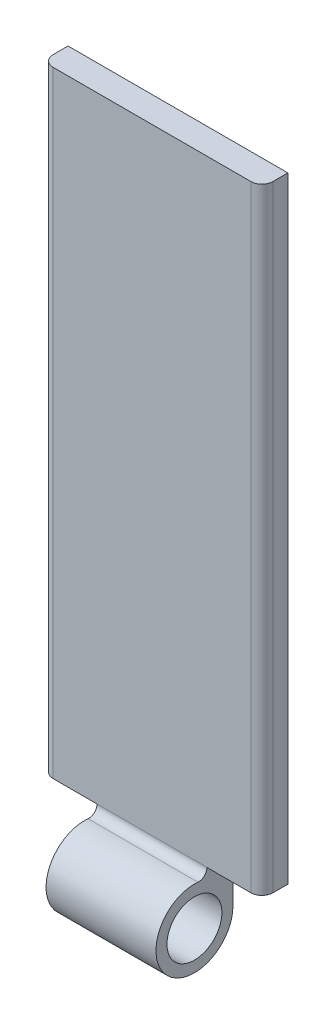
ISO-10303-21;
HEADER;
FILE_DESCRIPTION(('STEP AP214'),'2;1');
FILE_NAME('part.step','',(''),(''),'','','');
FILE_SCHEMA(('AUTOMOTIVE_DESIGN { 1 0 10303 214 1 1 1 1 }'));
ENDSEC;
DATA;
#1=APPLICATION_CONTEXT('core data for automotive mechanical design processes');
#2=APPLICATION_PROTOCOL_DEFINITION('international standard','automotive_design',2000,#1);
#3=PRODUCT_CONTEXT('',#1,'mechanical');
#4=PRODUCT('Part','Part','',(#3));
#5=PRODUCT_RELATED_PRODUCT_CATEGORY('part','',(#4));
#6=PRODUCT_DEFINITION_FORMATION('','',#4);
#7=PRODUCT_DEFINITION_CONTEXT('part definition',#1,'design');
#8=PRODUCT_DEFINITION('design','',#6,#7);
#9=PRODUCT_DEFINITION_SHAPE('','',#8);
#10=(LENGTH_UNIT() NAMED_UNIT(*) SI_UNIT(.MILLI.,.METRE.));
#11=(NAMED_UNIT(*) PLANE_ANGLE_UNIT() SI_UNIT($,.RADIAN.));
#12=(NAMED_UNIT(*) SI_UNIT($,.STERADIAN.) SOLID_ANGLE_UNIT());
#13=UNCERTAINTY_MEASURE_WITH_UNIT(LENGTH_MEASURE(1.E-05),#10,'distance_accuracy_value','');
#14=(GEOMETRIC_REPRESENTATION_CONTEXT(3) GLOBAL_UNCERTAINTY_ASSIGNED_CONTEXT((#13)) GLOBAL_UNIT_ASSIGNED_CONTEXT((#10,
#11,#12)) REPRESENTATION_CONTEXT('',''));
#15=CARTESIAN_POINT('',(0.,0.,0.));
#16=DIRECTION('',(0.,0.,1.));
#17=DIRECTION('',(1.,0.,0.));
#18=AXIS2_PLACEMENT_3D('',#15,#16,#17);
#19=CARTESIAN_POINT('',(25.4,-29.6203427117748,2.02927864234114));
#20=DIRECTION('',(-1.,0.,0.));
#21=DIRECTION('',(0.,0.,1.));
#22=AXIS2_PLACEMENT_3D('',#19,#20,#21);
#23=CYLINDRICAL_SURFACE('',#22,1.43383967509494);
#24=DIRECTION('',(-1.,0.,0.));
#25=VECTOR('',#24,1.);
#26=CARTESIAN_POINT('',(25.4,-29.6203427117748,0.595438967246198));
#27=LINE('',#26,#25);
#28=CARTESIAN_POINT('',(15.875,-29.6203427117748,0.595438967246198));
#29=VERTEX_POINT('',#28);
#30=CARTESIAN_POINT('',(-3.175,-29.6203427117748,0.595438967246198));
#31=VERTEX_POINT('',#30);
#32=EDGE_CURVE('E129',#29,#31,#27,.T.);
#33=ORIENTED_EDGE('',*,*,#32,.T.);
#34=CARTESIAN_POINT('',(-3.175,-29.6203427117748,2.02927864234114));
#35=DIRECTION('',(1.,0.,0.));
#36=DIRECTION('',(0.,0.,-1.));
#37=AXIS2_PLACEMENT_3D('',#34,#35,#36);
#38=CIRCLE('',#37,1.43383967509494);
#39=CARTESIAN_POINT('',(-3.175,-31.0482451370392,2.15962770371341));
#40=VERTEX_POINT('',#39);
#41=EDGE_CURVE('E208',#31,#40,#38,.F.);
#42=ORIENTED_EDGE('',*,*,#41,.T.);
#43=DIRECTION('',(-1.,0.,0.));
#44=VECTOR('',#43,1.);
#45=CARTESIAN_POINT('',(25.4,-31.0482451370391,2.15962770371341));
#46=LINE('',#45,#44);
#47=CARTESIAN_POINT('',(15.875,-31.0482451370392,2.15962770371341));
#48=VERTEX_POINT('',#47);
#49=EDGE_CURVE('E147',#48,#40,#46,.T.);
#50=ORIENTED_EDGE('',*,*,#49,.F.);
#51=CARTESIAN_POINT('',(15.875,-29.6203427117748,2.02927864234114));
#52=DIRECTION('',(1.,0.,0.));
#53=DIRECTION('',(0.,0.,-1.));
#54=AXIS2_PLACEMENT_3D('',#51,#52,#53);
#55=CIRCLE('',#54,1.43383967509494);
#56=EDGE_CURVE('E135',#29,#48,#55,.F.);
#57=ORIENTED_EDGE('',*,*,#56,.F.);
#58=EDGE_LOOP('',(#33,#42,#50,#57));
#59=FACE_BOUND('',#58,.T.);
#60=ADVANCED_FACE('F39',(#59),#23,.F.);
#61=CARTESIAN_POINT('',(25.4,-37.688136322795,2.76576406734977));
#62=DIRECTION('',(-1.,0.,0.));
#63=DIRECTION('',(0.,0.,1.));
#64=AXIS2_PLACEMENT_3D('',#61,#62,#63);
#65=CYLINDRICAL_SURFACE('',#64,6.6675);
#66=ORIENTED_EDGE('',*,*,#49,.T.);
#67=CARTESIAN_POINT('',(-3.175,-37.688136322795,2.76576406734977));
#68=DIRECTION('',(1.,0.,0.));
#69=DIRECTION('',(0.,0.,-1.));
#70=AXIS2_PLACEMENT_3D('',#67,#68,#69);
#71=CIRCLE('',#70,6.6675);
#72=CARTESIAN_POINT('',(-3.175,-37.688136322795,-3.90173593265023));
#73=VERTEX_POINT('',#72);
#74=EDGE_CURVE('E214',#40,#73,#71,.T.);
#75=ORIENTED_EDGE('',*,*,#74,.T.);
#76=DIRECTION('',(-1.,0.,0.));
#77=VECTOR('',#76,1.);
#78=CARTESIAN_POINT('',(25.4,-37.688136322795,-3.90173593265023));
#79=LINE('',#78,#77);
#80=CARTESIAN_POINT('',(15.875,-37.688136322795,-3.90173593265023));
#81=VERTEX_POINT('',#80);
#82=EDGE_CURVE('E170',#81,#73,#79,.T.);
#83=ORIENTED_EDGE('',*,*,#82,.F.);
#84=CARTESIAN_POINT('',(15.875,-37.688136322795,2.76576406734977));
#85=DIRECTION('',(1.,0.,0.));
#86=DIRECTION('',(0.,0.,-1.));
#87=AXIS2_PLACEMENT_3D('',#84,#85,#86);
#88=CIRCLE('',#87,6.6675);
#89=EDGE_CURVE('E150',#48,#81,#88,.T.);
#90=ORIENTED_EDGE('',*,*,#89,.F.);
#91=EDGE_LOOP('',(#66,#75,#83,#90));
#92=FACE_BOUND('',#91,.T.);
#93=ADVANCED_FACE('F252',(#92),#65,.T.);
#94=CARTESIAN_POINT('',(25.4,-37.688136322795,-3.90173593265023));
#95=DIRECTION('',(0.,0.,1.));
#96=DIRECTION('',(1.,0.,0.));
#97=AXIS2_PLACEMENT_3D('',#94,#95,#96);
#98=PLANE('',#97);
#99=ORIENTED_EDGE('',*,*,#82,.T.);
#100=DIRECTION('',(0.,1.,0.));
#101=VECTOR('',#100,1.);
#102=CARTESIAN_POINT('',(-3.175,-37.688136322795,-3.90173593265023));
#103=LINE('',#102,#101);
#104=CARTESIAN_POINT('',(-3.175,-29.6203427117748,-3.90173593265022));
#105=VERTEX_POINT('',#104);
#106=EDGE_CURVE('E185',#73,#105,#103,.T.);
#107=ORIENTED_EDGE('',*,*,#106,.T.);
#108=DIRECTION('',(-1.,0.,0.));
#109=VECTOR('',#108,1.);
#110=CARTESIAN_POINT('',(25.4,-29.6203427117748,-3.90173593265023));
#111=LINE('',#110,#109);
#112=CARTESIAN_POINT('',(-12.7,-29.6203427117748,-3.90173593265022));
#113=VERTEX_POINT('',#112);
#114=EDGE_CURVE('E212',#105,#113,#111,.T.);
#115=ORIENTED_EDGE('',*,*,#114,.T.);
#116=DIRECTION('',(0.,1.,0.));
#117=VECTOR('',#116,1.);
#118=CARTESIAN_POINT('',(-12.7,-37.688136322795,-3.90173593265023));
#119=LINE('',#118,#117);
#120=CARTESIAN_POINT('',(-12.7,77.155863613327,-3.90173593265023));
#121=VERTEX_POINT('',#120);
#122=EDGE_CURVE('E221',#113,#121,#119,.T.);
#123=ORIENTED_EDGE('',*,*,#122,.T.);
#124=DIRECTION('',(-1.,0.,0.));
#125=VECTOR('',#124,1.);
#126=CARTESIAN_POINT('',(25.4,77.155863613327,-3.90173593265023));
#127=LINE('',#126,#125);
#128=CARTESIAN_POINT('',(25.4,77.155863613327,-3.90173593265023));
#129=VERTEX_POINT('',#128);
#130=EDGE_CURVE('E166',#129,#121,#127,.T.);
#131=ORIENTED_EDGE('',*,*,#130,.F.);
#132=DIRECTION('',(0.,1.,0.));
#133=VECTOR('',#132,1.);
#134=CARTESIAN_POINT('',(25.4,-37.688136322795,-3.90173593265023));
#135=LINE('',#134,#133);
#136=CARTESIAN_POINT('',(25.4,-29.6203427117748,-3.90173593265023));
#137=VERTEX_POINT('',#136);
#138=EDGE_CURVE('E222',#137,#129,#135,.T.);
#139=ORIENTED_EDGE('',*,*,#138,.F.);
#140=DIRECTION('',(-1.,0.,0.));
#141=VECTOR('',#140,1.);
#142=CARTESIAN_POINT('',(25.4,-29.6203427117748,-3.90173593265023));
#143=LINE('',#142,#141);
#144=CARTESIAN_POINT('',(15.875,-29.6203427117748,-3.90173593265022));
#145=VERTEX_POINT('',#144);
#146=EDGE_CURVE('E205',#137,#145,#143,.T.);
#147=ORIENTED_EDGE('',*,*,#146,.T.);
#148=DIRECTION('',(0.,1.,0.));
#149=VECTOR('',#148,1.);
#150=CARTESIAN_POINT('',(15.875,-37.688136322795,-3.90173593265023));
#151=LINE('',#150,#149);
#152=EDGE_CURVE('E138',#81,#145,#151,.T.);
#153=ORIENTED_EDGE('',*,*,#152,.F.);
#154=EDGE_LOOP('',(#99,#107,#115,#123,#131,#139,#147,#153));
#155=FACE_BOUND('',#154,.T.);
#156=ADVANCED_FACE('F261',(#155),#98,.F.);
#157=CARTESIAN_POINT('',(25.4,-29.6203427117748,2.02927864234114));
#158=DIRECTION('',(-1.,0.,0.));
#159=DIRECTION('',(0.,0.,1.));
#160=AXIS2_PLACEMENT_3D('',#157,#158,#159);
#161=PLANE('',#160);
#162=DIRECTION('',(0.,0.,1.));
#163=VECTOR('',#162,1.);
#164=CARTESIAN_POINT('',(25.4,77.155863613327,-3.90173593265023));
#165=LINE('',#164,#163);
#166=CARTESIAN_POINT('',(25.4,77.155863613327,-1.3095610327538));
#167=VERTEX_POINT('',#166);
#168=EDGE_CURVE('E159',#129,#167,#165,.T.);
#169=ORIENTED_EDGE('',*,*,#168,.T.);
#170=DIRECTION('',(0.,-1.,0.));
#171=VECTOR('',#170,1.);
#172=CARTESIAN_POINT('',(25.4,-29.6203427117748,-1.3095610327538));
#173=LINE('',#172,#171);
#174=CARTESIAN_POINT('',(25.4,-29.6203427117748,-1.3095610327538));
#175=VERTEX_POINT('',#174);
#176=EDGE_CURVE('E48',#167,#175,#173,.T.);
#177=ORIENTED_EDGE('',*,*,#176,.T.);
#178=DIRECTION('',(0.,0.,-1.));
#179=VECTOR('',#178,1.);
#180=CARTESIAN_POINT('',(25.4,-29.6203427117748,2.02927864234114));
#181=LINE('',#180,#179);
#182=EDGE_CURVE('E204',#175,#137,#181,.T.);
#183=ORIENTED_EDGE('',*,*,#182,.T.);
#184=ORIENTED_EDGE('',*,*,#138,.T.);
#185=EDGE_LOOP('',(#169,#177,#183,#184));
#186=FACE_BOUND('',#185,.T.);
#187=ADVANCED_FACE('F203',(#186),#161,.F.);
#188=CARTESIAN_POINT('',(-12.7,-29.6203427117748,2.02927864234114));
#189=DIRECTION('',(-1.,0.,0.));
#190=DIRECTION('',(0.,0.,1.));
#191=AXIS2_PLACEMENT_3D('',#188,#189,#190);
#192=PLANE('',#191);
#193=DIRECTION('',(0.,0.,-1.));
#194=VECTOR('',#193,1.);
#195=CARTESIAN_POINT('',(-12.7,-29.6203427117748,38.6954389672462));
#196=LINE('',#195,#194);
#197=CARTESIAN_POINT('',(-12.7,-29.6203427117748,-1.3095610327538));
#198=VERTEX_POINT('',#197);
#199=EDGE_CURVE('E140',#198,#113,#196,.T.);
#200=ORIENTED_EDGE('',*,*,#199,.F.);
#201=DIRECTION('',(0.,-1.,0.));
#202=VECTOR('',#201,1.);
#203=CARTESIAN_POINT('',(-12.7,77.155863613327,-1.3095610327538));
#204=LINE('',#203,#202);
#205=CARTESIAN_POINT('',(-12.7,77.155863613327,-1.3095610327538));
#206=VERTEX_POINT('',#205);
#207=EDGE_CURVE('E194',#198,#206,#204,.F.);
#208=ORIENTED_EDGE('',*,*,#207,.T.);
#209=DIRECTION('',(0.,0.,1.));
#210=VECTOR('',#209,1.);
#211=CARTESIAN_POINT('',(-12.7,77.155863613327,-3.90173593265023));
#212=LINE('',#211,#210);
#213=EDGE_CURVE('E162',#121,#206,#212,.T.);
#214=ORIENTED_EDGE('',*,*,#213,.F.);
#215=ORIENTED_EDGE('',*,*,#122,.F.);
#216=EDGE_LOOP('',(#200,#208,#214,#215));
#217=FACE_BOUND('',#216,.T.);
#218=ADVANCED_FACE('F262',(#217),#192,.T.);
#219=CARTESIAN_POINT('',(25.4,77.155863613327,-3.90173593265023));
#220=DIRECTION('',(0.,-1.,0.));
#221=DIRECTION('',(0.,0.,-1.));
#222=AXIS2_PLACEMENT_3D('',#219,#220,#221);
#223=PLANE('',#222);
#224=ORIENTED_EDGE('',*,*,#213,.T.);
#225=CARTESIAN_POINT('',(-10.795,77.155863613327,-1.3095610327538));
#226=DIRECTION('',(0.,-1.,0.));
#227=DIRECTION('',(0.,0.,-1.));
#228=AXIS2_PLACEMENT_3D('',#225,#226,#227);
#229=CIRCLE('',#228,1.905);
#230=CARTESIAN_POINT('',(-10.795,77.155863613327,0.595438967246198));
#231=VERTEX_POINT('',#230);
#232=EDGE_CURVE('E199',#206,#231,#229,.F.);
#233=ORIENTED_EDGE('',*,*,#232,.T.);
#234=DIRECTION('',(-1.,0.,0.));
#235=VECTOR('',#234,1.);
#236=CARTESIAN_POINT('',(25.4,77.155863613327,0.595438967246198));
#237=LINE('',#236,#235);
#238=CARTESIAN_POINT('',(23.495,77.155863613327,0.595438967246198));
#239=VERTEX_POINT('',#238);
#240=EDGE_CURVE('E128',#239,#231,#237,.T.);
#241=ORIENTED_EDGE('',*,*,#240,.F.);
#242=CARTESIAN_POINT('',(23.495,77.155863613327,-1.3095610327538));
#243=DIRECTION('',(0.,-1.,0.));
#244=DIRECTION('',(0.,0.,-1.));
#245=AXIS2_PLACEMENT_3D('',#242,#243,#244);
#246=CIRCLE('',#245,1.905);
#247=EDGE_CURVE('E61',#239,#167,#246,.F.);
#248=ORIENTED_EDGE('',*,*,#247,.T.);
#249=ORIENTED_EDGE('',*,*,#168,.F.);
#250=ORIENTED_EDGE('',*,*,#130,.T.);
#251=EDGE_LOOP('',(#224,#233,#241,#248,#249,#250));
#252=FACE_BOUND('',#251,.T.);
#253=ADVANCED_FACE('F234',(#252),#223,.F.);
#254=CARTESIAN_POINT('',(25.4,-29.6203427117748,0.595438967246198));
#255=DIRECTION('',(0.,0.,-1.));
#256=DIRECTION('',(-1.,0.,0.));
#257=AXIS2_PLACEMENT_3D('',#254,#255,#256);
#258=PLANE('',#257);
#259=ORIENTED_EDGE('',*,*,#240,.T.);
#260=DIRECTION('',(0.,-1.,0.));
#261=VECTOR('',#260,1.);
#262=CARTESIAN_POINT('',(-10.795,-29.6203427117748,0.595438967246198));
#263=LINE('',#262,#261);
#264=CARTESIAN_POINT('',(-10.795,-29.6203427117748,0.595438967246198));
#265=VERTEX_POINT('',#264);
#266=EDGE_CURVE('E188',#231,#265,#263,.T.);
#267=ORIENTED_EDGE('',*,*,#266,.T.);
#268=EDGE_CURVE('E131',#31,#265,#27,.T.);
#269=ORIENTED_EDGE('',*,*,#268,.F.);
#270=ORIENTED_EDGE('',*,*,#32,.F.);
#271=CARTESIAN_POINT('',(23.495,-29.6203427117748,0.595438967246198));
#272=VERTEX_POINT('',#271);
#273=EDGE_CURVE('E118',#272,#29,#27,.T.);
#274=ORIENTED_EDGE('',*,*,#273,.F.);
#275=DIRECTION('',(0.,-1.,0.));
#276=VECTOR('',#275,1.);
#277=CARTESIAN_POINT('',(23.495,-29.6203427117748,0.595438967246198));
#278=LINE('',#277,#276);
#279=EDGE_CURVE('E176',#272,#239,#278,.F.);
#280=ORIENTED_EDGE('',*,*,#279,.T.);
#281=EDGE_LOOP('',(#259,#267,#269,#270,#274,#280));
#282=FACE_BOUND('',#281,.T.);
#283=ADVANCED_FACE('F154',(#282),#258,.F.);
#284=CARTESIAN_POINT('',(15.875,-29.6203427117748,38.6954389672462));
#285=DIRECTION('',(0.,1.,0.));
#286=DIRECTION('',(0.,0.,1.));
#287=AXIS2_PLACEMENT_3D('',#284,#285,#286);
#288=PLANE('',#287);
#289=ORIENTED_EDGE('',*,*,#182,.F.);
#290=CARTESIAN_POINT('',(23.495,-29.6203427117748,-1.3095610327538));
#291=DIRECTION('',(0.,1.,0.));
#292=DIRECTION('',(0.,0.,1.));
#293=AXIS2_PLACEMENT_3D('',#290,#291,#292);
#294=CIRCLE('',#293,1.905);
#295=EDGE_CURVE('E11',#175,#272,#294,.F.);
#296=ORIENTED_EDGE('',*,*,#295,.T.);
#297=ORIENTED_EDGE('',*,*,#273,.T.);
#298=DIRECTION('',(0.,0.,-1.));
#299=VECTOR('',#298,1.);
#300=CARTESIAN_POINT('',(15.875,-29.6203427117748,38.6954389672462));
#301=LINE('',#300,#299);
#302=EDGE_CURVE('E123',#29,#145,#301,.T.);
#303=ORIENTED_EDGE('',*,*,#302,.T.);
#304=ORIENTED_EDGE('',*,*,#146,.F.);
#305=EDGE_LOOP('',(#289,#296,#297,#303,#304));
#306=FACE_BOUND('',#305,.T.);
#307=ADVANCED_FACE('F121',(#306),#288,.F.);
#308=CARTESIAN_POINT('',(15.875,-29.6203427117748,38.6954389672462));
#309=DIRECTION('',(1.,0.,0.));
#310=DIRECTION('',(0.,0.,-1.));
#311=AXIS2_PLACEMENT_3D('',#308,#309,#310);
#312=PLANE('',#311);
#313=CARTESIAN_POINT('',(15.875,-37.688136322795,2.76576406734977));
#314=DIRECTION('',(1.,0.,0.));
#315=DIRECTION('',(0.,0.,-1.));
#316=AXIS2_PLACEMENT_3D('',#313,#314,#315);
#317=CIRCLE('',#316,4.7625);
#318=CARTESIAN_POINT('',(15.875,-37.688136322795,-1.99673593265023));
#319=VERTEX_POINT('',#318);
#320=EDGE_CURVE('E177',#319,#319,#317,.T.);
#321=ORIENTED_EDGE('',*,*,#320,.F.);
#322=EDGE_LOOP('',(#321));
#323=FACE_BOUND('',#322,.T.);
#324=ORIENTED_EDGE('',*,*,#56,.T.);
#325=ORIENTED_EDGE('',*,*,#89,.T.);
#326=ORIENTED_EDGE('',*,*,#152,.T.);
#327=ORIENTED_EDGE('',*,*,#302,.F.);
#328=EDGE_LOOP('',(#324,#325,#326,#327));
#329=FACE_BOUND('',#328,.T.);
#330=ADVANCED_FACE('F134',(#323,#329),#312,.T.);
#331=CARTESIAN_POINT('',(-12.7,-29.6203427117748,38.6954389672462));
#332=DIRECTION('',(0.,1.,0.));
#333=DIRECTION('',(0.,0.,1.));
#334=AXIS2_PLACEMENT_3D('',#331,#332,#333);
#335=PLANE('',#334);
#336=ORIENTED_EDGE('',*,*,#268,.T.);
#337=CARTESIAN_POINT('',(-10.795,-29.6203427117748,-1.3095610327538));
#338=DIRECTION('',(0.,1.,0.));
#339=DIRECTION('',(0.,0.,1.));
#340=AXIS2_PLACEMENT_3D('',#337,#338,#339);
#341=CIRCLE('',#340,1.905);
#342=EDGE_CURVE('E191',#265,#198,#341,.F.);
#343=ORIENTED_EDGE('',*,*,#342,.T.);
#344=ORIENTED_EDGE('',*,*,#199,.T.);
#345=ORIENTED_EDGE('',*,*,#114,.F.);
#346=DIRECTION('',(0.,0.,-1.));
#347=VECTOR('',#346,1.);
#348=CARTESIAN_POINT('',(-3.175,-29.6203427117748,38.6954389672462));
#349=LINE('',#348,#347);
#350=EDGE_CURVE('E181',#31,#105,#349,.T.);
#351=ORIENTED_EDGE('',*,*,#350,.F.);
#352=EDGE_LOOP('',(#336,#343,#344,#345,#351));
#353=FACE_BOUND('',#352,.T.);
#354=ADVANCED_FACE('F241',(#353),#335,.F.);
#355=CARTESIAN_POINT('',(-3.175,-29.6203427117748,38.6954389672462));
#356=DIRECTION('',(1.,0.,0.));
#357=DIRECTION('',(0.,0.,-1.));
#358=AXIS2_PLACEMENT_3D('',#355,#356,#357);
#359=PLANE('',#358);
#360=CARTESIAN_POINT('',(-3.175,-37.688136322795,2.76576406734977));
#361=DIRECTION('',(1.,0.,0.));
#362=DIRECTION('',(0.,0.,-1.));
#363=AXIS2_PLACEMENT_3D('',#360,#361,#362);
#364=CIRCLE('',#363,4.7625);
#365=CARTESIAN_POINT('',(-3.175,-37.688136322795,-1.99673593265023));
#366=VERTEX_POINT('',#365);
#367=EDGE_CURVE('E149',#366,#366,#364,.T.);
#368=ORIENTED_EDGE('',*,*,#367,.T.);
#369=EDGE_LOOP('',(#368));
#370=FACE_BOUND('',#369,.T.);
#371=ORIENTED_EDGE('',*,*,#350,.T.);
#372=ORIENTED_EDGE('',*,*,#106,.F.);
#373=ORIENTED_EDGE('',*,*,#74,.F.);
#374=ORIENTED_EDGE('',*,*,#41,.F.);
#375=EDGE_LOOP('',(#371,#372,#373,#374));
#376=FACE_BOUND('',#375,.T.);
#377=ADVANCED_FACE('F249',(#370,#376),#359,.F.);
#378=CARTESIAN_POINT('',(25.4,-37.688136322795,2.76576406734977));
#379=DIRECTION('',(-1.,0.,0.));
#380=DIRECTION('',(0.,0.,1.));
#381=AXIS2_PLACEMENT_3D('',#378,#379,#380);
#382=CYLINDRICAL_SURFACE('',#381,4.7625);
#383=ORIENTED_EDGE('',*,*,#367,.F.);
#384=EDGE_LOOP('',(#383));
#385=FACE_BOUND('',#384,.T.);
#386=ORIENTED_EDGE('',*,*,#320,.T.);
#387=EDGE_LOOP('',(#386));
#388=FACE_BOUND('',#387,.T.);
#389=ADVANCED_FACE('F282',(#385,#388),#382,.F.);
#390=CARTESIAN_POINT('',(-10.795,-29.6203427117748,-1.3095610327538));
#391=DIRECTION('',(0.,1.,0.));
#392=DIRECTION('',(0.,0.,1.));
#393=AXIS2_PLACEMENT_3D('',#390,#391,#392);
#394=CYLINDRICAL_SURFACE('',#393,1.905);
#395=ORIENTED_EDGE('',*,*,#232,.F.);
#396=ORIENTED_EDGE('',*,*,#207,.F.);
#397=ORIENTED_EDGE('',*,*,#342,.F.);
#398=ORIENTED_EDGE('',*,*,#266,.F.);
#399=EDGE_LOOP('',(#395,#396,#397,#398));
#400=FACE_BOUND('',#399,.T.);
#401=ADVANCED_FACE('F239',(#400),#394,.T.);
#402=CARTESIAN_POINT('',(23.495,-29.6203427117748,-1.3095610327538));
#403=DIRECTION('',(0.,-1.,0.));
#404=DIRECTION('',(0.,0.,-1.));
#405=AXIS2_PLACEMENT_3D('',#402,#403,#404);
#406=CYLINDRICAL_SURFACE('',#405,1.905);
#407=ORIENTED_EDGE('',*,*,#247,.F.);
#408=ORIENTED_EDGE('',*,*,#279,.F.);
#409=ORIENTED_EDGE('',*,*,#295,.F.);
#410=ORIENTED_EDGE('',*,*,#176,.F.);
#411=EDGE_LOOP('',(#407,#408,#409,#410));
#412=FACE_BOUND('',#411,.T.);
#413=ADVANCED_FACE('F41',(#412),#406,.T.);
#414=CLOSED_SHELL('',(#60,#93,#156,#187,#218,#253,#283,#307,#330,#354,#377,#389,#401,#413));
#415=MANIFOLD_SOLID_BREP('B2',#414);
#416=ADVANCED_BREP_SHAPE_REPRESENTATION('',(#18,#415),#14);
#417=SHAPE_DEFINITION_REPRESENTATION(#9,#416);
ENDSEC;
END-ISO-10303-21;
